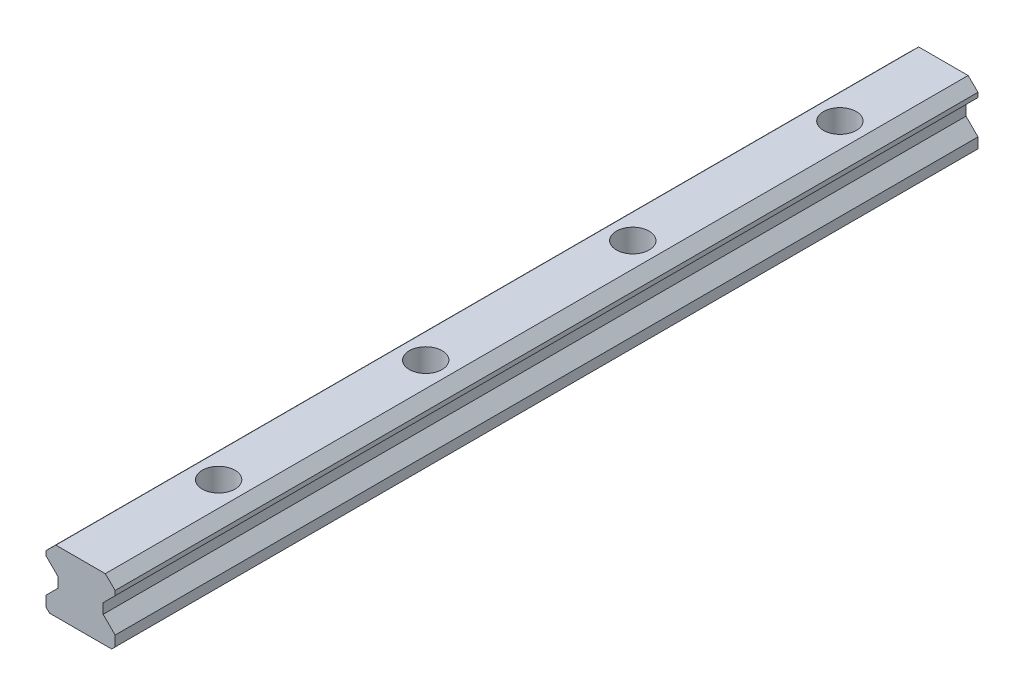
ISO-10303-21;
HEADER;
FILE_DESCRIPTION(('STEP AP214'),'2;1');
FILE_NAME('part.step','',(''),(''),'','','');
FILE_SCHEMA(('AUTOMOTIVE_DESIGN { 1 0 10303 214 1 1 1 1 }'));
ENDSEC;
DATA;
#1=APPLICATION_CONTEXT('core data for automotive mechanical design processes');
#2=APPLICATION_PROTOCOL_DEFINITION('international standard','automotive_design',2000,#1);
#3=PRODUCT_CONTEXT('',#1,'mechanical');
#4=PRODUCT('Part','Part','',(#3));
#5=PRODUCT_RELATED_PRODUCT_CATEGORY('part','',(#4));
#6=PRODUCT_DEFINITION_FORMATION('','',#4);
#7=PRODUCT_DEFINITION_CONTEXT('part definition',#1,'design');
#8=PRODUCT_DEFINITION('design','',#6,#7);
#9=PRODUCT_DEFINITION_SHAPE('','',#8);
#10=(LENGTH_UNIT() NAMED_UNIT(*) SI_UNIT(.MILLI.,.METRE.));
#11=(NAMED_UNIT(*) PLANE_ANGLE_UNIT() SI_UNIT($,.RADIAN.));
#12=(NAMED_UNIT(*) SI_UNIT($,.STERADIAN.) SOLID_ANGLE_UNIT());
#13=UNCERTAINTY_MEASURE_WITH_UNIT(LENGTH_MEASURE(1.E-05),#10,'distance_accuracy_value','');
#14=(GEOMETRIC_REPRESENTATION_CONTEXT(3) GLOBAL_UNCERTAINTY_ASSIGNED_CONTEXT((#13)) GLOBAL_UNIT_ASSIGNED_CONTEXT((#10,
#11,#12)) REPRESENTATION_CONTEXT('',''));
#15=CARTESIAN_POINT('',(0.,0.,0.));
#16=DIRECTION('',(0.,0.,1.));
#17=DIRECTION('',(1.,0.,0.));
#18=AXIS2_PLACEMENT_3D('',#15,#16,#17);
#19=CARTESIAN_POINT('',(0.,18.,250.));
#20=DIRECTION('',(0.,-1.,0.));
#21=DIRECTION('',(0.,0.,-1.));
#22=AXIS2_PLACEMENT_3D('',#19,#20,#21);
#23=PLANE('',#22);
#24=CARTESIAN_POINT('',(0.,18.,210.));
#25=DIRECTION('',(0.,1.,0.));
#26=DIRECTION('',(0.,0.,1.));
#27=AXIS2_PLACEMENT_3D('',#24,#25,#26);
#28=CIRCLE('',#27,4.75);
#29=CARTESIAN_POINT('',(0.,18.,214.75));
#30=VERTEX_POINT('',#29);
#31=EDGE_CURVE('E326',#30,#30,#28,.T.);
#32=ORIENTED_EDGE('',*,*,#31,.F.);
#33=EDGE_LOOP('',(#32));
#34=FACE_BOUND('',#33,.T.);
#35=CARTESIAN_POINT('',(0.,18.,150.));
#36=DIRECTION('',(0.,1.,0.));
#37=DIRECTION('',(0.,0.,1.));
#38=AXIS2_PLACEMENT_3D('',#35,#36,#37);
#39=CIRCLE('',#38,4.75);
#40=CARTESIAN_POINT('',(0.,18.,154.75));
#41=VERTEX_POINT('',#40);
#42=EDGE_CURVE('E330',#41,#41,#39,.T.);
#43=ORIENTED_EDGE('',*,*,#42,.F.);
#44=EDGE_LOOP('',(#43));
#45=FACE_BOUND('',#44,.T.);
#46=CARTESIAN_POINT('',(0.,18.,90.));
#47=DIRECTION('',(0.,1.,0.));
#48=DIRECTION('',(0.,0.,1.));
#49=AXIS2_PLACEMENT_3D('',#46,#47,#48);
#50=CIRCLE('',#49,4.75);
#51=CARTESIAN_POINT('',(0.,18.,94.75));
#52=VERTEX_POINT('',#51);
#53=EDGE_CURVE('E334',#52,#52,#50,.T.);
#54=ORIENTED_EDGE('',*,*,#53,.F.);
#55=EDGE_LOOP('',(#54));
#56=FACE_BOUND('',#55,.T.);
#57=CARTESIAN_POINT('',(0.,18.,30.));
#58=DIRECTION('',(0.,1.,0.));
#59=DIRECTION('',(0.,0.,1.));
#60=AXIS2_PLACEMENT_3D('',#57,#58,#59);
#61=CIRCLE('',#60,4.75);
#62=CARTESIAN_POINT('',(0.,18.,34.75));
#63=VERTEX_POINT('',#62);
#64=EDGE_CURVE('E337',#63,#63,#61,.T.);
#65=ORIENTED_EDGE('',*,*,#64,.F.);
#66=EDGE_LOOP('',(#65));
#67=FACE_BOUND('',#66,.T.);
#68=DIRECTION('',(-1.,0.,0.));
#69=VECTOR('',#68,1.);
#70=CARTESIAN_POINT('',(0.,18.,0.));
#71=LINE('',#70,#69);
#72=CARTESIAN_POINT('',(7.16,18.,0.));
#73=VERTEX_POINT('',#72);
#74=CARTESIAN_POINT('',(-7.16,18.,0.));
#75=VERTEX_POINT('',#74);
#76=EDGE_CURVE('E186',#73,#75,#71,.T.);
#77=ORIENTED_EDGE('',*,*,#76,.T.);
#78=DIRECTION('',(0.,0.,-1.));
#79=VECTOR('',#78,1.);
#80=CARTESIAN_POINT('',(-7.16,18.,250.));
#81=LINE('',#80,#79);
#82=CARTESIAN_POINT('',(-7.16,18.,250.));
#83=VERTEX_POINT('',#82);
#84=EDGE_CURVE('E12',#83,#75,#81,.T.);
#85=ORIENTED_EDGE('',*,*,#84,.F.);
#86=DIRECTION('',(-1.,0.,0.));
#87=VECTOR('',#86,1.);
#88=CARTESIAN_POINT('',(0.,18.,250.));
#89=LINE('',#88,#87);
#90=CARTESIAN_POINT('',(7.16,18.,250.));
#91=VERTEX_POINT('',#90);
#92=EDGE_CURVE('E123',#91,#83,#89,.T.);
#93=ORIENTED_EDGE('',*,*,#92,.F.);
#94=DIRECTION('',(0.,0.,-1.));
#95=VECTOR('',#94,1.);
#96=CARTESIAN_POINT('',(7.16,18.,250.));
#97=LINE('',#96,#95);
#98=EDGE_CURVE('E182',#91,#73,#97,.T.);
#99=ORIENTED_EDGE('',*,*,#98,.T.);
#100=EDGE_LOOP('',(#77,#85,#93,#99));
#101=FACE_BOUND('',#100,.T.);
#102=ADVANCED_FACE('F43',(#34,#45,#56,#67,#101),#23,.F.);
#103=CARTESIAN_POINT('',(-12.4844762186534,12.8113912514247,250.));
#104=DIRECTION('',(-0.697910097647056,0.716185377959001,0.));
#105=DIRECTION('',(-0.716185377959001,-0.697910097647056,0.));
#106=AXIS2_PLACEMENT_3D('',#103,#104,#105);
#107=PLANE('',#106);
#108=DIRECTION('',(0.716185377959001,0.697910097647056,0.));
#109=VECTOR('',#108,1.);
#110=CARTESIAN_POINT('',(-12.4844762186534,12.8113912514247,0.));
#111=LINE('',#110,#109);
#112=CARTESIAN_POINT('',(-10.0182337649086,15.2147012947258,0.));
#113=VERTEX_POINT('',#112);
#114=EDGE_CURVE('E189',#113,#75,#111,.T.);
#115=ORIENTED_EDGE('',*,*,#114,.F.);
#116=DIRECTION('',(0.,0.,-1.));
#117=VECTOR('',#116,1.);
#118=CARTESIAN_POINT('',(-10.0182337649086,15.2147012947258,250.));
#119=LINE('',#118,#117);
#120=CARTESIAN_POINT('',(-10.0182337649086,15.2147012947258,250.));
#121=VERTEX_POINT('',#120);
#122=EDGE_CURVE('E51',#121,#113,#119,.T.);
#123=ORIENTED_EDGE('',*,*,#122,.F.);
#124=DIRECTION('',(0.716185377959001,0.697910097647056,0.));
#125=VECTOR('',#124,1.);
#126=CARTESIAN_POINT('',(-12.4844762186534,12.8113912514247,250.));
#127=LINE('',#126,#125);
#128=EDGE_CURVE('E272',#121,#83,#127,.T.);
#129=ORIENTED_EDGE('',*,*,#128,.T.);
#130=ORIENTED_EDGE('',*,*,#84,.T.);
#131=EDGE_LOOP('',(#115,#123,#129,#130));
#132=FACE_BOUND('',#131,.T.);
#133=ADVANCED_FACE('F259',(#132),#107,.T.);
#134=CARTESIAN_POINT('',(-10.0182337649086,0.,250.));
#135=DIRECTION('',(-1.,0.,0.));
#136=DIRECTION('',(0.,-1.,0.));
#137=AXIS2_PLACEMENT_3D('',#134,#135,#136);
#138=PLANE('',#137);
#139=DIRECTION('',(0.,1.,0.));
#140=VECTOR('',#139,1.);
#141=CARTESIAN_POINT('',(-10.0182337649086,0.,0.));
#142=LINE('',#141,#140);
#143=CARTESIAN_POINT('',(-10.0182337649086,13.8847012947258,0.));
#144=VERTEX_POINT('',#143);
#145=EDGE_CURVE('E193',#144,#113,#142,.T.);
#146=ORIENTED_EDGE('',*,*,#145,.F.);
#147=DIRECTION('',(0.,0.,-1.));
#148=VECTOR('',#147,1.);
#149=CARTESIAN_POINT('',(-10.0182337649086,13.8847012947258,250.));
#150=LINE('',#149,#148);
#151=CARTESIAN_POINT('',(-10.0182337649086,13.8847012947258,250.));
#152=VERTEX_POINT('',#151);
#153=EDGE_CURVE('E249',#152,#144,#150,.T.);
#154=ORIENTED_EDGE('',*,*,#153,.F.);
#155=DIRECTION('',(0.,1.,0.));
#156=VECTOR('',#155,1.);
#157=CARTESIAN_POINT('',(-10.0182337649086,0.,250.));
#158=LINE('',#157,#156);
#159=EDGE_CURVE('E256',#152,#121,#158,.T.);
#160=ORIENTED_EDGE('',*,*,#159,.T.);
#161=ORIENTED_EDGE('',*,*,#122,.T.);
#162=EDGE_LOOP('',(#146,#154,#160,#161));
#163=FACE_BOUND('',#162,.T.);
#164=ADVANCED_FACE('F254',(#163),#138,.T.);
#165=CARTESIAN_POINT('',(1.93323376490863,1.93323376490864,250.));
#166=DIRECTION('',(-0.707106781186546,-0.707106781186549,0.));
#167=DIRECTION('',(0.707106781186549,-0.707106781186546,0.));
#168=AXIS2_PLACEMENT_3D('',#165,#166,#167);
#169=PLANE('',#168);
#170=DIRECTION('',(-0.707106781186549,0.707106781186546,0.));
#171=VECTOR('',#170,1.);
#172=CARTESIAN_POINT('',(1.93323376490863,1.93323376490864,0.));
#173=LINE('',#172,#171);
#174=CARTESIAN_POINT('',(-6.55,10.4164675298172,0.));
#175=VERTEX_POINT('',#174);
#176=EDGE_CURVE('E196',#175,#144,#173,.T.);
#177=ORIENTED_EDGE('',*,*,#176,.F.);
#178=DIRECTION('',(0.,0.,-1.));
#179=VECTOR('',#178,1.);
#180=CARTESIAN_POINT('',(-6.55,10.4164675298172,250.));
#181=LINE('',#180,#179);
#182=CARTESIAN_POINT('',(-6.55,10.4164675298172,250.));
#183=VERTEX_POINT('',#182);
#184=EDGE_CURVE('E247',#183,#175,#181,.T.);
#185=ORIENTED_EDGE('',*,*,#184,.F.);
#186=DIRECTION('',(-0.707106781186549,0.707106781186546,0.));
#187=VECTOR('',#186,1.);
#188=CARTESIAN_POINT('',(1.93323376490863,1.93323376490864,250.));
#189=LINE('',#188,#187);
#190=EDGE_CURVE('E269',#183,#152,#189,.T.);
#191=ORIENTED_EDGE('',*,*,#190,.T.);
#192=ORIENTED_EDGE('',*,*,#153,.T.);
#193=EDGE_LOOP('',(#177,#185,#191,#192));
#194=FACE_BOUND('',#193,.T.);
#195=ADVANCED_FACE('F266',(#194),#169,.T.);
#196=CARTESIAN_POINT('',(-6.55,0.,250.));
#197=DIRECTION('',(-1.,0.,0.));
#198=DIRECTION('',(0.,0.,1.));
#199=AXIS2_PLACEMENT_3D('',#196,#197,#198);
#200=PLANE('',#199);
#201=DIRECTION('',(0.,1.,0.));
#202=VECTOR('',#201,1.);
#203=CARTESIAN_POINT('',(-6.55,0.,0.));
#204=LINE('',#203,#202);
#205=CARTESIAN_POINT('',(-6.55,7.48646752981724,0.));
#206=VERTEX_POINT('',#205);
#207=EDGE_CURVE('E199',#206,#175,#204,.T.);
#208=ORIENTED_EDGE('',*,*,#207,.F.);
#209=DIRECTION('',(0.,0.,-1.));
#210=VECTOR('',#209,1.);
#211=CARTESIAN_POINT('',(-6.55,7.48646752981724,250.));
#212=LINE('',#211,#210);
#213=CARTESIAN_POINT('',(-6.55,7.48646752981724,250.));
#214=VERTEX_POINT('',#213);
#215=EDGE_CURVE('E245',#214,#206,#212,.T.);
#216=ORIENTED_EDGE('',*,*,#215,.F.);
#217=DIRECTION('',(0.,1.,0.));
#218=VECTOR('',#217,1.);
#219=CARTESIAN_POINT('',(-6.55,0.,250.));
#220=LINE('',#219,#218);
#221=EDGE_CURVE('E274',#214,#183,#220,.T.);
#222=ORIENTED_EDGE('',*,*,#221,.T.);
#223=ORIENTED_EDGE('',*,*,#184,.T.);
#224=EDGE_LOOP('',(#208,#216,#222,#223));
#225=FACE_BOUND('',#224,.T.);
#226=ADVANCED_FACE('F538',(#225),#200,.T.);
#227=CARTESIAN_POINT('',(-7.01823376490861,7.01823376490863,250.));
#228=DIRECTION('',(-0.707106781186546,0.707106781186549,0.));
#229=DIRECTION('',(-0.707106781186549,-0.707106781186546,0.));
#230=AXIS2_PLACEMENT_3D('',#227,#228,#229);
#231=PLANE('',#230);
#232=DIRECTION('',(0.707106781186549,0.707106781186546,0.));
#233=VECTOR('',#232,1.);
#234=CARTESIAN_POINT('',(-7.01823376490861,7.01823376490863,0.));
#235=LINE('',#234,#233);
#236=CARTESIAN_POINT('',(-10.0182337649086,4.01823376490864,0.));
#237=VERTEX_POINT('',#236);
#238=EDGE_CURVE('E202',#237,#206,#235,.T.);
#239=ORIENTED_EDGE('',*,*,#238,.F.);
#240=DIRECTION('',(0.,0.,-1.));
#241=VECTOR('',#240,1.);
#242=CARTESIAN_POINT('',(-10.0182337649086,4.01823376490864,250.));
#243=LINE('',#242,#241);
#244=CARTESIAN_POINT('',(-10.0182337649086,4.01823376490864,250.));
#245=VERTEX_POINT('',#244);
#246=EDGE_CURVE('E243',#245,#237,#243,.T.);
#247=ORIENTED_EDGE('',*,*,#246,.F.);
#248=DIRECTION('',(0.707106781186549,0.707106781186546,0.));
#249=VECTOR('',#248,1.);
#250=CARTESIAN_POINT('',(-7.01823376490861,7.01823376490863,250.));
#251=LINE('',#250,#249);
#252=EDGE_CURVE('E280',#245,#214,#251,.T.);
#253=ORIENTED_EDGE('',*,*,#252,.T.);
#254=ORIENTED_EDGE('',*,*,#215,.T.);
#255=EDGE_LOOP('',(#239,#247,#253,#254));
#256=FACE_BOUND('',#255,.T.);
#257=ADVANCED_FACE('F536',(#256),#231,.T.);
#258=CARTESIAN_POINT('',(-10.0182337649086,0.,250.));
#259=DIRECTION('',(-1.,0.,0.));
#260=DIRECTION('',(0.,-1.,0.));
#261=AXIS2_PLACEMENT_3D('',#258,#259,#260);
#262=PLANE('',#261);
#263=DIRECTION('',(0.,1.,0.));
#264=VECTOR('',#263,1.);
#265=CARTESIAN_POINT('',(-10.0182337649086,0.,0.));
#266=LINE('',#265,#264);
#267=CARTESIAN_POINT('',(-10.0182337649086,1.01823376490864,0.));
#268=VERTEX_POINT('',#267);
#269=EDGE_CURVE('E205',#268,#237,#266,.T.);
#270=ORIENTED_EDGE('',*,*,#269,.F.);
#271=DIRECTION('',(0.,0.,-1.));
#272=VECTOR('',#271,1.);
#273=CARTESIAN_POINT('',(-10.0182337649086,1.01823376490864,250.));
#274=LINE('',#273,#272);
#275=CARTESIAN_POINT('',(-10.0182337649086,1.01823376490864,250.));
#276=VERTEX_POINT('',#275);
#277=EDGE_CURVE('E241',#276,#268,#274,.T.);
#278=ORIENTED_EDGE('',*,*,#277,.F.);
#279=DIRECTION('',(0.,1.,0.));
#280=VECTOR('',#279,1.);
#281=CARTESIAN_POINT('',(-10.0182337649086,0.,250.));
#282=LINE('',#281,#280);
#283=EDGE_CURVE('E283',#276,#245,#282,.T.);
#284=ORIENTED_EDGE('',*,*,#283,.T.);
#285=ORIENTED_EDGE('',*,*,#246,.T.);
#286=EDGE_LOOP('',(#270,#278,#284,#285));
#287=FACE_BOUND('',#286,.T.);
#288=ADVANCED_FACE('F533',(#287),#262,.T.);
#289=CARTESIAN_POINT('',(-4.50000000000008,-4.5,250.));
#290=DIRECTION('',(0.707106781186554,0.707106781186541,0.));
#291=DIRECTION('',(-0.707106781186541,0.707106781186554,0.));
#292=AXIS2_PLACEMENT_3D('',#289,#290,#291);
#293=PLANE('',#292);
#294=DIRECTION('',(0.707106781186541,-0.707106781186554,0.));
#295=VECTOR('',#294,1.);
#296=CARTESIAN_POINT('',(-4.50000000000008,-4.5,0.));
#297=LINE('',#296,#295);
#298=CARTESIAN_POINT('',(-9.,0.,0.));
#299=VERTEX_POINT('',#298);
#300=EDGE_CURVE('E208',#268,#299,#297,.T.);
#301=ORIENTED_EDGE('',*,*,#300,.T.);
#302=DIRECTION('',(0.,0.,-1.));
#303=VECTOR('',#302,1.);
#304=CARTESIAN_POINT('',(-9.,0.,250.));
#305=LINE('',#304,#303);
#306=CARTESIAN_POINT('',(-9.,0.,250.));
#307=VERTEX_POINT('',#306);
#308=EDGE_CURVE('E238',#307,#299,#305,.T.);
#309=ORIENTED_EDGE('',*,*,#308,.F.);
#310=DIRECTION('',(0.707106781186541,-0.707106781186554,0.));
#311=VECTOR('',#310,1.);
#312=CARTESIAN_POINT('',(-4.50000000000008,-4.5,250.));
#313=LINE('',#312,#311);
#314=EDGE_CURVE('E286',#276,#307,#313,.T.);
#315=ORIENTED_EDGE('',*,*,#314,.F.);
#316=ORIENTED_EDGE('',*,*,#277,.T.);
#317=EDGE_LOOP('',(#301,#309,#315,#316));
#318=FACE_BOUND('',#317,.T.);
#319=ADVANCED_FACE('F510',(#318),#293,.F.);
#320=CARTESIAN_POINT('',(0.,0.,250.));
#321=DIRECTION('',(0.,1.,0.));
#322=DIRECTION('',(-1.,0.,0.));
#323=AXIS2_PLACEMENT_3D('',#320,#321,#322);
#324=PLANE('',#323);
#325=CARTESIAN_POINT('',(0.,0.,210.));
#326=DIRECTION('',(0.,1.,0.));
#327=DIRECTION('',(0.,0.,1.));
#328=AXIS2_PLACEMENT_3D('',#325,#326,#327);
#329=CIRCLE('',#328,2.75);
#330=CARTESIAN_POINT('',(0.,0.,212.75));
#331=VERTEX_POINT('',#330);
#332=EDGE_CURVE('E490',#331,#331,#329,.T.);
#333=ORIENTED_EDGE('',*,*,#332,.T.);
#334=EDGE_LOOP('',(#333));
#335=FACE_BOUND('',#334,.T.);
#336=CARTESIAN_POINT('',(0.,0.,150.));
#337=DIRECTION('',(0.,1.,0.));
#338=DIRECTION('',(0.,0.,1.));
#339=AXIS2_PLACEMENT_3D('',#336,#337,#338);
#340=CIRCLE('',#339,2.75);
#341=CARTESIAN_POINT('',(0.,0.,152.75));
#342=VERTEX_POINT('',#341);
#343=EDGE_CURVE('E372',#342,#342,#340,.T.);
#344=ORIENTED_EDGE('',*,*,#343,.T.);
#345=EDGE_LOOP('',(#344));
#346=FACE_BOUND('',#345,.T.);
#347=CARTESIAN_POINT('',(0.,0.,90.));
#348=DIRECTION('',(0.,1.,0.));
#349=DIRECTION('',(0.,0.,1.));
#350=AXIS2_PLACEMENT_3D('',#347,#348,#349);
#351=CIRCLE('',#350,2.75);
#352=CARTESIAN_POINT('',(0.,0.,92.75));
#353=VERTEX_POINT('',#352);
#354=EDGE_CURVE('E340',#353,#353,#351,.T.);
#355=ORIENTED_EDGE('',*,*,#354,.T.);
#356=EDGE_LOOP('',(#355));
#357=FACE_BOUND('',#356,.T.);
#358=CARTESIAN_POINT('',(0.,0.,30.));
#359=DIRECTION('',(0.,1.,0.));
#360=DIRECTION('',(0.,0.,1.));
#361=AXIS2_PLACEMENT_3D('',#358,#359,#360);
#362=CIRCLE('',#361,2.75);
#363=CARTESIAN_POINT('',(0.,0.,32.75));
#364=VERTEX_POINT('',#363);
#365=EDGE_CURVE('E190',#364,#364,#362,.T.);
#366=ORIENTED_EDGE('',*,*,#365,.T.);
#367=EDGE_LOOP('',(#366));
#368=FACE_BOUND('',#367,.T.);
#369=DIRECTION('',(1.,0.,0.));
#370=VECTOR('',#369,1.);
#371=CARTESIAN_POINT('',(0.,0.,0.));
#372=LINE('',#371,#370);
#373=CARTESIAN_POINT('',(9.,0.,0.));
#374=VERTEX_POINT('',#373);
#375=EDGE_CURVE('E210',#299,#374,#372,.T.);
#376=ORIENTED_EDGE('',*,*,#375,.T.);
#377=DIRECTION('',(0.,0.,-1.));
#378=VECTOR('',#377,1.);
#379=CARTESIAN_POINT('',(9.,0.,250.));
#380=LINE('',#379,#378);
#381=CARTESIAN_POINT('',(9.,0.,250.));
#382=VERTEX_POINT('',#381);
#383=EDGE_CURVE('E236',#382,#374,#380,.T.);
#384=ORIENTED_EDGE('',*,*,#383,.F.);
#385=DIRECTION('',(1.,0.,0.));
#386=VECTOR('',#385,1.);
#387=CARTESIAN_POINT('',(0.,0.,250.));
#388=LINE('',#387,#386);
#389=EDGE_CURVE('E288',#307,#382,#388,.T.);
#390=ORIENTED_EDGE('',*,*,#389,.F.);
#391=ORIENTED_EDGE('',*,*,#308,.T.);
#392=EDGE_LOOP('',(#376,#384,#390,#391));
#393=FACE_BOUND('',#392,.T.);
#394=ADVANCED_FACE('F506',(#335,#346,#357,#368,#393),#324,.F.);
#395=CARTESIAN_POINT('',(4.50000000000008,-4.5,250.));
#396=DIRECTION('',(0.707106781186554,-0.707106781186541,0.));
#397=DIRECTION('',(0.707106781186541,0.707106781186554,0.));
#398=AXIS2_PLACEMENT_3D('',#395,#396,#397);
#399=PLANE('',#398);
#400=DIRECTION('',(-0.707106781186541,-0.707106781186554,0.));
#401=VECTOR('',#400,1.);
#402=CARTESIAN_POINT('',(4.50000000000008,-4.5,0.));
#403=LINE('',#402,#401);
#404=CARTESIAN_POINT('',(10.0182337649086,1.01823376490864,0.));
#405=VERTEX_POINT('',#404);
#406=EDGE_CURVE('E213',#405,#374,#403,.T.);
#407=ORIENTED_EDGE('',*,*,#406,.F.);
#408=DIRECTION('',(0.,0.,-1.));
#409=VECTOR('',#408,1.);
#410=CARTESIAN_POINT('',(10.0182337649086,1.01823376490864,250.));
#411=LINE('',#410,#409);
#412=CARTESIAN_POINT('',(10.0182337649086,1.01823376490864,250.));
#413=VERTEX_POINT('',#412);
#414=EDGE_CURVE('E234',#413,#405,#411,.T.);
#415=ORIENTED_EDGE('',*,*,#414,.F.);
#416=DIRECTION('',(-0.707106781186541,-0.707106781186554,0.));
#417=VECTOR('',#416,1.);
#418=CARTESIAN_POINT('',(4.50000000000008,-4.5,250.));
#419=LINE('',#418,#417);
#420=EDGE_CURVE('E290',#413,#382,#419,.T.);
#421=ORIENTED_EDGE('',*,*,#420,.T.);
#422=ORIENTED_EDGE('',*,*,#383,.T.);
#423=EDGE_LOOP('',(#407,#415,#421,#422));
#424=FACE_BOUND('',#423,.T.);
#425=ADVANCED_FACE('F509',(#424),#399,.T.);
#426=CARTESIAN_POINT('',(10.0182337649086,0.,250.));
#427=DIRECTION('',(-1.,0.,0.));
#428=DIRECTION('',(0.,-1.,0.));
#429=AXIS2_PLACEMENT_3D('',#426,#427,#428);
#430=PLANE('',#429);
#431=DIRECTION('',(0.,1.,0.));
#432=VECTOR('',#431,1.);
#433=CARTESIAN_POINT('',(10.0182337649086,0.,0.));
#434=LINE('',#433,#432);
#435=CARTESIAN_POINT('',(10.0182337649086,4.01823376490864,0.));
#436=VERTEX_POINT('',#435);
#437=EDGE_CURVE('E216',#405,#436,#434,.T.);
#438=ORIENTED_EDGE('',*,*,#437,.T.);
#439=DIRECTION('',(0.,0.,-1.));
#440=VECTOR('',#439,1.);
#441=CARTESIAN_POINT('',(10.0182337649086,4.01823376490864,250.));
#442=LINE('',#441,#440);
#443=CARTESIAN_POINT('',(10.0182337649086,4.01823376490864,250.));
#444=VERTEX_POINT('',#443);
#445=EDGE_CURVE('E231',#444,#436,#442,.T.);
#446=ORIENTED_EDGE('',*,*,#445,.F.);
#447=DIRECTION('',(0.,1.,0.));
#448=VECTOR('',#447,1.);
#449=CARTESIAN_POINT('',(10.0182337649086,0.,250.));
#450=LINE('',#449,#448);
#451=EDGE_CURVE('E293',#413,#444,#450,.T.);
#452=ORIENTED_EDGE('',*,*,#451,.F.);
#453=ORIENTED_EDGE('',*,*,#414,.T.);
#454=EDGE_LOOP('',(#438,#446,#452,#453));
#455=FACE_BOUND('',#454,.T.);
#456=ADVANCED_FACE('F593',(#455),#430,.F.);
#457=CARTESIAN_POINT('',(7.0182337649086,7.01823376490864,250.));
#458=DIRECTION('',(-0.707106781186546,-0.707106781186549,0.));
#459=DIRECTION('',(0.707106781186549,-0.707106781186546,0.));
#460=AXIS2_PLACEMENT_3D('',#457,#458,#459);
#461=PLANE('',#460);
#462=DIRECTION('',(-0.707106781186549,0.707106781186546,0.));
#463=VECTOR('',#462,1.);
#464=CARTESIAN_POINT('',(7.0182337649086,7.01823376490864,0.));
#465=LINE('',#464,#463);
#466=CARTESIAN_POINT('',(6.55,7.48646752981724,0.));
#467=VERTEX_POINT('',#466);
#468=EDGE_CURVE('E218',#436,#467,#465,.T.);
#469=ORIENTED_EDGE('',*,*,#468,.T.);
#470=DIRECTION('',(0.,0.,-1.));
#471=VECTOR('',#470,1.);
#472=CARTESIAN_POINT('',(6.55,7.48646752981724,250.));
#473=LINE('',#472,#471);
#474=CARTESIAN_POINT('',(6.55,7.48646752981724,250.));
#475=VERTEX_POINT('',#474);
#476=EDGE_CURVE('E228',#475,#467,#473,.T.);
#477=ORIENTED_EDGE('',*,*,#476,.F.);
#478=DIRECTION('',(-0.707106781186549,0.707106781186546,0.));
#479=VECTOR('',#478,1.);
#480=CARTESIAN_POINT('',(7.0182337649086,7.01823376490864,250.));
#481=LINE('',#480,#479);
#482=EDGE_CURVE('E295',#444,#475,#481,.T.);
#483=ORIENTED_EDGE('',*,*,#482,.F.);
#484=ORIENTED_EDGE('',*,*,#445,.T.);
#485=EDGE_LOOP('',(#469,#477,#483,#484));
#486=FACE_BOUND('',#485,.T.);
#487=ADVANCED_FACE('F302',(#486),#461,.F.);
#488=CARTESIAN_POINT('',(6.55,0.,250.));
#489=DIRECTION('',(-1.,0.,0.));
#490=DIRECTION('',(0.,0.,1.));
#491=AXIS2_PLACEMENT_3D('',#488,#489,#490);
#492=PLANE('',#491);
#493=DIRECTION('',(0.,1.,0.));
#494=VECTOR('',#493,1.);
#495=CARTESIAN_POINT('',(6.55,0.,0.));
#496=LINE('',#495,#494);
#497=CARTESIAN_POINT('',(6.55,10.4164675298172,0.));
#498=VERTEX_POINT('',#497);
#499=EDGE_CURVE('E220',#467,#498,#496,.T.);
#500=ORIENTED_EDGE('',*,*,#499,.T.);
#501=DIRECTION('',(0.,0.,-1.));
#502=VECTOR('',#501,1.);
#503=CARTESIAN_POINT('',(6.55,10.4164675298172,250.));
#504=LINE('',#503,#502);
#505=CARTESIAN_POINT('',(6.55,10.4164675298172,250.));
#506=VERTEX_POINT('',#505);
#507=EDGE_CURVE('E177',#506,#498,#504,.T.);
#508=ORIENTED_EDGE('',*,*,#507,.F.);
#509=DIRECTION('',(0.,1.,0.));
#510=VECTOR('',#509,1.);
#511=CARTESIAN_POINT('',(6.55,0.,250.));
#512=LINE('',#511,#510);
#513=EDGE_CURVE('E168',#475,#506,#512,.T.);
#514=ORIENTED_EDGE('',*,*,#513,.F.);
#515=ORIENTED_EDGE('',*,*,#476,.T.);
#516=EDGE_LOOP('',(#500,#508,#514,#515));
#517=FACE_BOUND('',#516,.T.);
#518=ADVANCED_FACE('F306',(#517),#492,.F.);
#519=CARTESIAN_POINT('',(-1.93323376490863,1.93323376490864,250.));
#520=DIRECTION('',(-0.707106781186546,0.707106781186549,0.));
#521=DIRECTION('',(-0.707106781186549,-0.707106781186546,0.));
#522=AXIS2_PLACEMENT_3D('',#519,#520,#521);
#523=PLANE('',#522);
#524=DIRECTION('',(0.707106781186549,0.707106781186546,0.));
#525=VECTOR('',#524,1.);
#526=CARTESIAN_POINT('',(-1.93323376490863,1.93323376490864,0.));
#527=LINE('',#526,#525);
#528=CARTESIAN_POINT('',(10.0182337649086,13.8847012947258,0.));
#529=VERTEX_POINT('',#528);
#530=EDGE_CURVE('E176',#498,#529,#527,.T.);
#531=ORIENTED_EDGE('',*,*,#530,.T.);
#532=DIRECTION('',(0.,0.,-1.));
#533=VECTOR('',#532,1.);
#534=CARTESIAN_POINT('',(10.0182337649086,13.8847012947258,250.));
#535=LINE('',#534,#533);
#536=CARTESIAN_POINT('',(10.0182337649086,13.8847012947258,250.));
#537=VERTEX_POINT('',#536);
#538=EDGE_CURVE('E173',#537,#529,#535,.T.);
#539=ORIENTED_EDGE('',*,*,#538,.F.);
#540=DIRECTION('',(0.707106781186549,0.707106781186546,0.));
#541=VECTOR('',#540,1.);
#542=CARTESIAN_POINT('',(-1.93323376490863,1.93323376490864,250.));
#543=LINE('',#542,#541);
#544=EDGE_CURVE('E162',#506,#537,#543,.T.);
#545=ORIENTED_EDGE('',*,*,#544,.F.);
#546=ORIENTED_EDGE('',*,*,#507,.T.);
#547=EDGE_LOOP('',(#531,#539,#545,#546));
#548=FACE_BOUND('',#547,.T.);
#549=ADVANCED_FACE('F174',(#548),#523,.F.);
#550=CARTESIAN_POINT('',(10.0182337649086,0.,250.));
#551=DIRECTION('',(-1.,0.,0.));
#552=DIRECTION('',(0.,-1.,0.));
#553=AXIS2_PLACEMENT_3D('',#550,#551,#552);
#554=PLANE('',#553);
#555=DIRECTION('',(0.,1.,0.));
#556=VECTOR('',#555,1.);
#557=CARTESIAN_POINT('',(10.0182337649086,0.,0.));
#558=LINE('',#557,#556);
#559=CARTESIAN_POINT('',(10.0182337649086,15.2147012947258,0.));
#560=VERTEX_POINT('',#559);
#561=EDGE_CURVE('E111',#529,#560,#558,.T.);
#562=ORIENTED_EDGE('',*,*,#561,.T.);
#563=DIRECTION('',(0.,0.,-1.));
#564=VECTOR('',#563,1.);
#565=CARTESIAN_POINT('',(10.0182337649086,15.2147012947258,250.));
#566=LINE('',#565,#564);
#567=CARTESIAN_POINT('',(10.0182337649086,15.2147012947258,250.));
#568=VERTEX_POINT('',#567);
#569=EDGE_CURVE('E178',#568,#560,#566,.T.);
#570=ORIENTED_EDGE('',*,*,#569,.F.);
#571=DIRECTION('',(0.,1.,0.));
#572=VECTOR('',#571,1.);
#573=CARTESIAN_POINT('',(10.0182337649086,0.,250.));
#574=LINE('',#573,#572);
#575=EDGE_CURVE('E166',#537,#568,#574,.T.);
#576=ORIENTED_EDGE('',*,*,#575,.F.);
#577=ORIENTED_EDGE('',*,*,#538,.T.);
#578=EDGE_LOOP('',(#562,#570,#576,#577));
#579=FACE_BOUND('',#578,.T.);
#580=ADVANCED_FACE('F180',(#579),#554,.F.);
#581=CARTESIAN_POINT('',(12.4844762186534,12.8113912514247,250.));
#582=DIRECTION('',(-0.697910097647056,-0.716185377959001,0.));
#583=DIRECTION('',(0.716185377959001,-0.697910097647056,0.));
#584=AXIS2_PLACEMENT_3D('',#581,#582,#583);
#585=PLANE('',#584);
#586=DIRECTION('',(-0.716185377959001,0.697910097647056,0.));
#587=VECTOR('',#586,1.);
#588=CARTESIAN_POINT('',(12.4844762186534,12.8113912514247,0.));
#589=LINE('',#588,#587);
#590=EDGE_CURVE('E117',#560,#73,#589,.T.);
#591=ORIENTED_EDGE('',*,*,#590,.T.);
#592=ORIENTED_EDGE('',*,*,#98,.F.);
#593=DIRECTION('',(-0.716185377959001,0.697910097647056,0.));
#594=VECTOR('',#593,1.);
#595=CARTESIAN_POINT('',(12.4844762186534,12.8113912514247,250.));
#596=LINE('',#595,#594);
#597=EDGE_CURVE('E59',#568,#91,#596,.T.);
#598=ORIENTED_EDGE('',*,*,#597,.F.);
#599=ORIENTED_EDGE('',*,*,#569,.T.);
#600=EDGE_LOOP('',(#591,#592,#598,#599));
#601=FACE_BOUND('',#600,.T.);
#602=ADVANCED_FACE('F308',(#601),#585,.F.);
#603=CARTESIAN_POINT('',(0.,0.,250.));
#604=DIRECTION('',(0.,0.,1.));
#605=DIRECTION('',(1.,0.,0.));
#606=AXIS2_PLACEMENT_3D('',#603,#604,#605);
#607=PLANE('',#606);
#608=ORIENTED_EDGE('',*,*,#92,.T.);
#609=ORIENTED_EDGE('',*,*,#128,.F.);
#610=ORIENTED_EDGE('',*,*,#159,.F.);
#611=ORIENTED_EDGE('',*,*,#190,.F.);
#612=ORIENTED_EDGE('',*,*,#221,.F.);
#613=ORIENTED_EDGE('',*,*,#252,.F.);
#614=ORIENTED_EDGE('',*,*,#283,.F.);
#615=ORIENTED_EDGE('',*,*,#314,.T.);
#616=ORIENTED_EDGE('',*,*,#389,.T.);
#617=ORIENTED_EDGE('',*,*,#420,.F.);
#618=ORIENTED_EDGE('',*,*,#451,.T.);
#619=ORIENTED_EDGE('',*,*,#482,.T.);
#620=ORIENTED_EDGE('',*,*,#513,.T.);
#621=ORIENTED_EDGE('',*,*,#544,.T.);
#622=ORIENTED_EDGE('',*,*,#575,.T.);
#623=ORIENTED_EDGE('',*,*,#597,.T.);
#624=EDGE_LOOP('',(#608,#609,#610,#611,#612,#613,#614,#615,#616,#617,#618,#619,#620,#621,#622,#623));
#625=FACE_BOUND('',#624,.T.);
#626=ADVANCED_FACE('F164',(#625),#607,.T.);
#627=CARTESIAN_POINT('',(0.,0.,0.));
#628=DIRECTION('',(0.,0.,1.));
#629=DIRECTION('',(1.,0.,0.));
#630=AXIS2_PLACEMENT_3D('',#627,#628,#629);
#631=PLANE('',#630);
#632=ORIENTED_EDGE('',*,*,#76,.F.);
#633=ORIENTED_EDGE('',*,*,#590,.F.);
#634=ORIENTED_EDGE('',*,*,#561,.F.);
#635=ORIENTED_EDGE('',*,*,#530,.F.);
#636=ORIENTED_EDGE('',*,*,#499,.F.);
#637=ORIENTED_EDGE('',*,*,#468,.F.);
#638=ORIENTED_EDGE('',*,*,#437,.F.);
#639=ORIENTED_EDGE('',*,*,#406,.T.);
#640=ORIENTED_EDGE('',*,*,#375,.F.);
#641=ORIENTED_EDGE('',*,*,#300,.F.);
#642=ORIENTED_EDGE('',*,*,#269,.T.);
#643=ORIENTED_EDGE('',*,*,#238,.T.);
#644=ORIENTED_EDGE('',*,*,#207,.T.);
#645=ORIENTED_EDGE('',*,*,#176,.T.);
#646=ORIENTED_EDGE('',*,*,#145,.T.);
#647=ORIENTED_EDGE('',*,*,#114,.T.);
#648=EDGE_LOOP('',(#632,#633,#634,#635,#636,#637,#638,#639,#640,#641,#642,#643,#644,#645,#646,#647));
#649=FACE_BOUND('',#648,.T.);
#650=ADVANCED_FACE('F262',(#649),#631,.F.);
#651=CARTESIAN_POINT('',(0.,18.,30.));
#652=DIRECTION('',(0.,1.,0.));
#653=DIRECTION('',(0.,0.,1.));
#654=AXIS2_PLACEMENT_3D('',#651,#652,#653);
#655=CYLINDRICAL_SURFACE('',#654,2.75000000000001);
#656=ORIENTED_EDGE('',*,*,#365,.F.);
#657=EDGE_LOOP('',(#656));
#658=FACE_BOUND('',#657,.T.);
#659=CARTESIAN_POINT('',(0.,9.50000000000001,30.));
#660=DIRECTION('',(0.,1.,0.));
#661=DIRECTION('',(0.,0.,1.));
#662=AXIS2_PLACEMENT_3D('',#659,#660,#661);
#663=CIRCLE('',#662,2.75000000000001);
#664=CARTESIAN_POINT('',(0.,9.50000000000001,32.75));
#665=VERTEX_POINT('',#664);
#666=EDGE_CURVE('E343',#665,#665,#663,.T.);
#667=ORIENTED_EDGE('',*,*,#666,.T.);
#668=EDGE_LOOP('',(#667));
#669=FACE_BOUND('',#668,.T.);
#670=ADVANCED_FACE('F409',(#658,#669),#655,.F.);
#671=CARTESIAN_POINT('',(2.75000000000001,9.50000000000001,30.));
#672=DIRECTION('',(0.,-1.,0.));
#673=DIRECTION('',(0.,0.,-1.));
#674=AXIS2_PLACEMENT_3D('',#671,#672,#673);
#675=PLANE('',#674);
#676=ORIENTED_EDGE('',*,*,#666,.F.);
#677=EDGE_LOOP('',(#676));
#678=FACE_BOUND('',#677,.T.);
#679=CARTESIAN_POINT('',(0.,9.5,30.));
#680=DIRECTION('',(0.,1.,0.));
#681=DIRECTION('',(0.,0.,1.));
#682=AXIS2_PLACEMENT_3D('',#679,#680,#681);
#683=CIRCLE('',#682,4.75);
#684=CARTESIAN_POINT('',(0.,9.5,34.75));
#685=VERTEX_POINT('',#684);
#686=EDGE_CURVE('E339',#685,#685,#683,.T.);
#687=ORIENTED_EDGE('',*,*,#686,.T.);
#688=EDGE_LOOP('',(#687));
#689=FACE_BOUND('',#688,.T.);
#690=ADVANCED_FACE('F405',(#678,#689),#675,.F.);
#691=CARTESIAN_POINT('',(0.,18.,30.));
#692=DIRECTION('',(0.,1.,0.));
#693=DIRECTION('',(0.,0.,1.));
#694=AXIS2_PLACEMENT_3D('',#691,#692,#693);
#695=CYLINDRICAL_SURFACE('',#694,4.75);
#696=ORIENTED_EDGE('',*,*,#686,.F.);
#697=EDGE_LOOP('',(#696));
#698=FACE_BOUND('',#697,.T.);
#699=ORIENTED_EDGE('',*,*,#64,.T.);
#700=EDGE_LOOP('',(#699));
#701=FACE_BOUND('',#700,.T.);
#702=ADVANCED_FACE('F401',(#698,#701),#695,.F.);
#703=CARTESIAN_POINT('',(0.,18.,90.));
#704=DIRECTION('',(0.,1.,0.));
#705=DIRECTION('',(0.,0.,1.));
#706=AXIS2_PLACEMENT_3D('',#703,#704,#705);
#707=CYLINDRICAL_SURFACE('',#706,2.75000000000001);
#708=ORIENTED_EDGE('',*,*,#354,.F.);
#709=EDGE_LOOP('',(#708));
#710=FACE_BOUND('',#709,.T.);
#711=CARTESIAN_POINT('',(0.,9.50000000000001,90.));
#712=DIRECTION('',(0.,1.,0.));
#713=DIRECTION('',(0.,0.,1.));
#714=AXIS2_PLACEMENT_3D('',#711,#712,#713);
#715=CIRCLE('',#714,2.75000000000001);
#716=CARTESIAN_POINT('',(0.,9.50000000000001,92.75));
#717=VERTEX_POINT('',#716);
#718=EDGE_CURVE('E346',#717,#717,#715,.T.);
#719=ORIENTED_EDGE('',*,*,#718,.T.);
#720=EDGE_LOOP('',(#719));
#721=FACE_BOUND('',#720,.T.);
#722=ADVANCED_FACE('F394',(#710,#721),#707,.F.);
#723=CARTESIAN_POINT('',(2.75000000000001,9.50000000000001,90.));
#724=DIRECTION('',(0.,-1.,0.));
#725=DIRECTION('',(0.,0.,-1.));
#726=AXIS2_PLACEMENT_3D('',#723,#724,#725);
#727=PLANE('',#726);
#728=ORIENTED_EDGE('',*,*,#718,.F.);
#729=EDGE_LOOP('',(#728));
#730=FACE_BOUND('',#729,.T.);
#731=CARTESIAN_POINT('',(0.,9.5,90.));
#732=DIRECTION('',(0.,1.,0.));
#733=DIRECTION('',(0.,0.,1.));
#734=AXIS2_PLACEMENT_3D('',#731,#732,#733);
#735=CIRCLE('',#734,4.75);
#736=CARTESIAN_POINT('',(0.,9.5,94.75));
#737=VERTEX_POINT('',#736);
#738=EDGE_CURVE('E364',#737,#737,#735,.T.);
#739=ORIENTED_EDGE('',*,*,#738,.T.);
#740=EDGE_LOOP('',(#739));
#741=FACE_BOUND('',#740,.T.);
#742=ADVANCED_FACE('F381',(#730,#741),#727,.F.);
#743=CARTESIAN_POINT('',(0.,18.,90.));
#744=DIRECTION('',(0.,1.,0.));
#745=DIRECTION('',(0.,0.,1.));
#746=AXIS2_PLACEMENT_3D('',#743,#744,#745);
#747=CYLINDRICAL_SURFACE('',#746,4.75);
#748=ORIENTED_EDGE('',*,*,#738,.F.);
#749=EDGE_LOOP('',(#748));
#750=FACE_BOUND('',#749,.T.);
#751=ORIENTED_EDGE('',*,*,#53,.T.);
#752=EDGE_LOOP('',(#751));
#753=FACE_BOUND('',#752,.T.);
#754=ADVANCED_FACE('F383',(#750,#753),#747,.F.);
#755=CARTESIAN_POINT('',(0.,18.,150.));
#756=DIRECTION('',(0.,1.,0.));
#757=DIRECTION('',(0.,0.,1.));
#758=AXIS2_PLACEMENT_3D('',#755,#756,#757);
#759=CYLINDRICAL_SURFACE('',#758,2.75000000000001);
#760=ORIENTED_EDGE('',*,*,#343,.F.);
#761=EDGE_LOOP('',(#760));
#762=FACE_BOUND('',#761,.T.);
#763=CARTESIAN_POINT('',(0.,9.50000000000001,150.));
#764=DIRECTION('',(0.,1.,0.));
#765=DIRECTION('',(0.,0.,1.));
#766=AXIS2_PLACEMENT_3D('',#763,#764,#765);
#767=CIRCLE('',#766,2.75000000000001);
#768=CARTESIAN_POINT('',(0.,9.50000000000001,152.75));
#769=VERTEX_POINT('',#768);
#770=EDGE_CURVE('E367',#769,#769,#767,.T.);
#771=ORIENTED_EDGE('',*,*,#770,.T.);
#772=EDGE_LOOP('',(#771));
#773=FACE_BOUND('',#772,.T.);
#774=ADVANCED_FACE('F385',(#762,#773),#759,.F.);
#775=CARTESIAN_POINT('',(2.75000000000001,9.50000000000001,150.));
#776=DIRECTION('',(0.,-1.,0.));
#777=DIRECTION('',(0.,0.,-1.));
#778=AXIS2_PLACEMENT_3D('',#775,#776,#777);
#779=PLANE('',#778);
#780=ORIENTED_EDGE('',*,*,#770,.F.);
#781=EDGE_LOOP('',(#780));
#782=FACE_BOUND('',#781,.T.);
#783=CARTESIAN_POINT('',(0.,9.5,150.));
#784=DIRECTION('',(0.,1.,0.));
#785=DIRECTION('',(0.,0.,1.));
#786=AXIS2_PLACEMENT_3D('',#783,#784,#785);
#787=CIRCLE('',#786,4.75);
#788=CARTESIAN_POINT('',(0.,9.5,154.75));
#789=VERTEX_POINT('',#788);
#790=EDGE_CURVE('E373',#789,#789,#787,.T.);
#791=ORIENTED_EDGE('',*,*,#790,.T.);
#792=EDGE_LOOP('',(#791));
#793=FACE_BOUND('',#792,.T.);
#794=ADVANCED_FACE('F391',(#782,#793),#779,.F.);
#795=CARTESIAN_POINT('',(0.,18.,150.));
#796=DIRECTION('',(0.,1.,0.));
#797=DIRECTION('',(0.,0.,1.));
#798=AXIS2_PLACEMENT_3D('',#795,#796,#797);
#799=CYLINDRICAL_SURFACE('',#798,4.75);
#800=ORIENTED_EDGE('',*,*,#790,.F.);
#801=EDGE_LOOP('',(#800));
#802=FACE_BOUND('',#801,.T.);
#803=ORIENTED_EDGE('',*,*,#42,.T.);
#804=EDGE_LOOP('',(#803));
#805=FACE_BOUND('',#804,.T.);
#806=ADVANCED_FACE('F455',(#802,#805),#799,.F.);
#807=CARTESIAN_POINT('',(0.,18.,210.));
#808=DIRECTION('',(0.,1.,0.));
#809=DIRECTION('',(0.,0.,1.));
#810=AXIS2_PLACEMENT_3D('',#807,#808,#809);
#811=CYLINDRICAL_SURFACE('',#810,2.75000000000001);
#812=ORIENTED_EDGE('',*,*,#332,.F.);
#813=EDGE_LOOP('',(#812));
#814=FACE_BOUND('',#813,.T.);
#815=CARTESIAN_POINT('',(0.,9.50000000000001,210.));
#816=DIRECTION('',(0.,1.,0.));
#817=DIRECTION('',(0.,0.,1.));
#818=AXIS2_PLACEMENT_3D('',#815,#816,#817);
#819=CIRCLE('',#818,2.75000000000001);
#820=CARTESIAN_POINT('',(0.,9.50000000000001,212.75));
#821=VERTEX_POINT('',#820);
#822=EDGE_CURVE('E492',#821,#821,#819,.T.);
#823=ORIENTED_EDGE('',*,*,#822,.T.);
#824=EDGE_LOOP('',(#823));
#825=FACE_BOUND('',#824,.T.);
#826=ADVANCED_FACE('F467',(#814,#825),#811,.F.);
#827=CARTESIAN_POINT('',(2.75000000000001,9.50000000000001,210.));
#828=DIRECTION('',(0.,-1.,0.));
#829=DIRECTION('',(0.,0.,-1.));
#830=AXIS2_PLACEMENT_3D('',#827,#828,#829);
#831=PLANE('',#830);
#832=ORIENTED_EDGE('',*,*,#822,.F.);
#833=EDGE_LOOP('',(#832));
#834=FACE_BOUND('',#833,.T.);
#835=CARTESIAN_POINT('',(0.,9.5,210.));
#836=DIRECTION('',(0.,1.,0.));
#837=DIRECTION('',(0.,0.,1.));
#838=AXIS2_PLACEMENT_3D('',#835,#836,#837);
#839=CIRCLE('',#838,4.75);
#840=CARTESIAN_POINT('',(0.,9.5,214.75));
#841=VERTEX_POINT('',#840);
#842=EDGE_CURVE('E497',#841,#841,#839,.T.);
#843=ORIENTED_EDGE('',*,*,#842,.T.);
#844=EDGE_LOOP('',(#843));
#845=FACE_BOUND('',#844,.T.);
#846=ADVANCED_FACE('F463',(#834,#845),#831,.F.);
#847=CARTESIAN_POINT('',(0.,18.,210.));
#848=DIRECTION('',(0.,1.,0.));
#849=DIRECTION('',(0.,0.,1.));
#850=AXIS2_PLACEMENT_3D('',#847,#848,#849);
#851=CYLINDRICAL_SURFACE('',#850,4.75);
#852=ORIENTED_EDGE('',*,*,#842,.F.);
#853=EDGE_LOOP('',(#852));
#854=FACE_BOUND('',#853,.T.);
#855=ORIENTED_EDGE('',*,*,#31,.T.);
#856=EDGE_LOOP('',(#855));
#857=FACE_BOUND('',#856,.T.);
#858=ADVANCED_FACE('F447',(#854,#857),#851,.F.);
#859=CLOSED_SHELL('',(#102,#133,#164,#195,#226,#257,#288,#319,#394,#425,#456,#487,#518,#549,
#580,#602,#626,#650,#670,#690,#702,#722,#742,#754,#774,#794,#806,#826,#846,#858));
#860=MANIFOLD_SOLID_BREP('B2',#859);
#861=ADVANCED_BREP_SHAPE_REPRESENTATION('',(#18,#860),#14);
#862=SHAPE_DEFINITION_REPRESENTATION(#9,#861);
ENDSEC;
END-ISO-10303-21;
